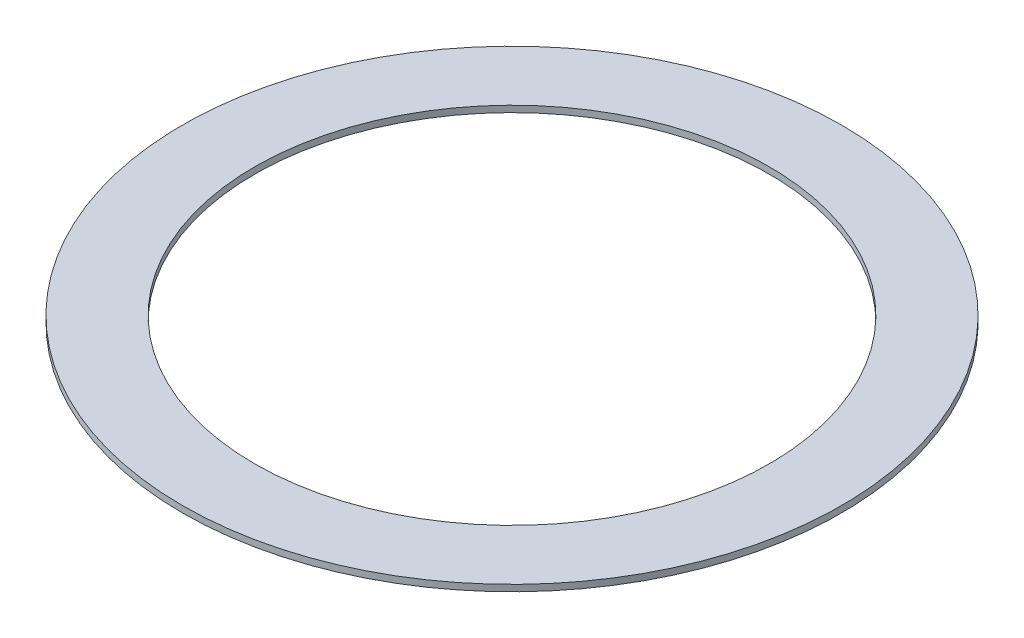
ISO-10303-21;
HEADER;
FILE_DESCRIPTION(('STEP AP214'),'2;1');
FILE_NAME('part.step','',(''),(''),'','','');
FILE_SCHEMA(('AUTOMOTIVE_DESIGN { 1 0 10303 214 1 1 1 1 }'));
ENDSEC;
DATA;
#1=APPLICATION_CONTEXT('core data for automotive mechanical design processes');
#2=APPLICATION_PROTOCOL_DEFINITION('international standard','automotive_design',2000,#1);
#3=PRODUCT_CONTEXT('',#1,'mechanical');
#4=PRODUCT('Part','Part','',(#3));
#5=PRODUCT_RELATED_PRODUCT_CATEGORY('part','',(#4));
#6=PRODUCT_DEFINITION_FORMATION('','',#4);
#7=PRODUCT_DEFINITION_CONTEXT('part definition',#1,'design');
#8=PRODUCT_DEFINITION('design','',#6,#7);
#9=PRODUCT_DEFINITION_SHAPE('','',#8);
#10=(LENGTH_UNIT() NAMED_UNIT(*) SI_UNIT(.MILLI.,.METRE.));
#11=(NAMED_UNIT(*) PLANE_ANGLE_UNIT() SI_UNIT($,.RADIAN.));
#12=(NAMED_UNIT(*) SI_UNIT($,.STERADIAN.) SOLID_ANGLE_UNIT());
#13=UNCERTAINTY_MEASURE_WITH_UNIT(LENGTH_MEASURE(1.E-05),#10,'distance_accuracy_value','');
#14=(GEOMETRIC_REPRESENTATION_CONTEXT(3) GLOBAL_UNCERTAINTY_ASSIGNED_CONTEXT((#13)) GLOBAL_UNIT_ASSIGNED_CONTEXT((#10,
#11,#12)) REPRESENTATION_CONTEXT('',''));
#15=CARTESIAN_POINT('',(0.,0.,0.));
#16=DIRECTION('',(0.,0.,1.));
#17=DIRECTION('',(1.,0.,0.));
#18=AXIS2_PLACEMENT_3D('',#15,#16,#17);
#19=CARTESIAN_POINT('',(0.,0.40005,0.));
#20=DIRECTION('',(0.,1.,0.));
#21=DIRECTION('',(0.,0.,1.));
#22=AXIS2_PLACEMENT_3D('',#19,#20,#21);
#23=PLANE('',#22);
#24=CARTESIAN_POINT('',(0.,0.40005,0.));
#25=DIRECTION('',(0.,1.,0.));
#26=DIRECTION('',(0.,0.,1.));
#27=AXIS2_PLACEMENT_3D('',#24,#25,#26);
#28=CIRCLE('',#27,41.021);
#29=CARTESIAN_POINT('',(0.,0.40005,41.021));
#30=VERTEX_POINT('',#29);
#31=EDGE_CURVE('E10',#30,#30,#28,.T.);
#32=ORIENTED_EDGE('',*,*,#31,.T.);
#33=EDGE_LOOP('',(#32));
#34=FACE_BOUND('',#33,.T.);
#35=CARTESIAN_POINT('',(0.,0.40005,0.));
#36=DIRECTION('',(0.,1.,0.));
#37=DIRECTION('',(0.,0.,1.));
#38=AXIS2_PLACEMENT_3D('',#35,#36,#37);
#39=CIRCLE('',#38,32.0294);
#40=CARTESIAN_POINT('',(0.,0.40005,32.0294));
#41=VERTEX_POINT('',#40);
#42=EDGE_CURVE('E55',#41,#41,#39,.T.);
#43=ORIENTED_EDGE('',*,*,#42,.F.);
#44=EDGE_LOOP('',(#43));
#45=FACE_BOUND('',#44,.T.);
#46=ADVANCED_FACE('F41',(#34,#45),#23,.T.);
#47=CARTESIAN_POINT('',(0.,-0.40005,0.));
#48=DIRECTION('',(0.,1.,0.));
#49=DIRECTION('',(0.,0.,1.));
#50=AXIS2_PLACEMENT_3D('',#47,#48,#49);
#51=PLANE('',#50);
#52=CARTESIAN_POINT('',(0.,-0.40005,0.));
#53=DIRECTION('',(0.,1.,0.));
#54=DIRECTION('',(0.,0.,1.));
#55=AXIS2_PLACEMENT_3D('',#52,#53,#54);
#56=CIRCLE('',#55,41.021);
#57=CARTESIAN_POINT('',(0.,-0.40005,41.021));
#58=VERTEX_POINT('',#57);
#59=EDGE_CURVE('E45',#58,#58,#56,.T.);
#60=ORIENTED_EDGE('',*,*,#59,.F.);
#61=EDGE_LOOP('',(#60));
#62=FACE_BOUND('',#61,.T.);
#63=CARTESIAN_POINT('',(0.,-0.40005,0.));
#64=DIRECTION('',(0.,1.,0.));
#65=DIRECTION('',(0.,0.,1.));
#66=AXIS2_PLACEMENT_3D('',#63,#64,#65);
#67=CIRCLE('',#66,32.0294);
#68=CARTESIAN_POINT('',(0.,-0.40005,32.0294));
#69=VERTEX_POINT('',#68);
#70=EDGE_CURVE('E57',#69,#69,#67,.T.);
#71=ORIENTED_EDGE('',*,*,#70,.T.);
#72=EDGE_LOOP('',(#71));
#73=FACE_BOUND('',#72,.T.);
#74=ADVANCED_FACE('F68',(#62,#73),#51,.F.);
#75=CARTESIAN_POINT('',(0.,0.40005,0.));
#76=DIRECTION('',(0.,-1.,0.));
#77=DIRECTION('',(0.,0.,-1.));
#78=AXIS2_PLACEMENT_3D('',#75,#76,#77);
#79=CYLINDRICAL_SURFACE('',#78,41.021);
#80=ORIENTED_EDGE('',*,*,#31,.F.);
#81=EDGE_LOOP('',(#80));
#82=FACE_BOUND('',#81,.T.);
#83=ORIENTED_EDGE('',*,*,#59,.T.);
#84=EDGE_LOOP('',(#83));
#85=FACE_BOUND('',#84,.T.);
#86=ADVANCED_FACE('F43',(#82,#85),#79,.T.);
#87=CARTESIAN_POINT('',(0.,0.40005,0.));
#88=DIRECTION('',(0.,-1.,0.));
#89=DIRECTION('',(0.,0.,-1.));
#90=AXIS2_PLACEMENT_3D('',#87,#88,#89);
#91=CYLINDRICAL_SURFACE('',#90,32.0294);
#92=ORIENTED_EDGE('',*,*,#42,.T.);
#93=EDGE_LOOP('',(#92));
#94=FACE_BOUND('',#93,.T.);
#95=ORIENTED_EDGE('',*,*,#70,.F.);
#96=EDGE_LOOP('',(#95));
#97=FACE_BOUND('',#96,.T.);
#98=ADVANCED_FACE('F64',(#94,#97),#91,.F.);
#99=CLOSED_SHELL('',(#46,#74,#86,#98));
#100=MANIFOLD_SOLID_BREP('B2',#99);
#101=ADVANCED_BREP_SHAPE_REPRESENTATION('',(#18,#100),#14);
#102=SHAPE_DEFINITION_REPRESENTATION(#9,#101);
ENDSEC;
END-ISO-10303-21;
